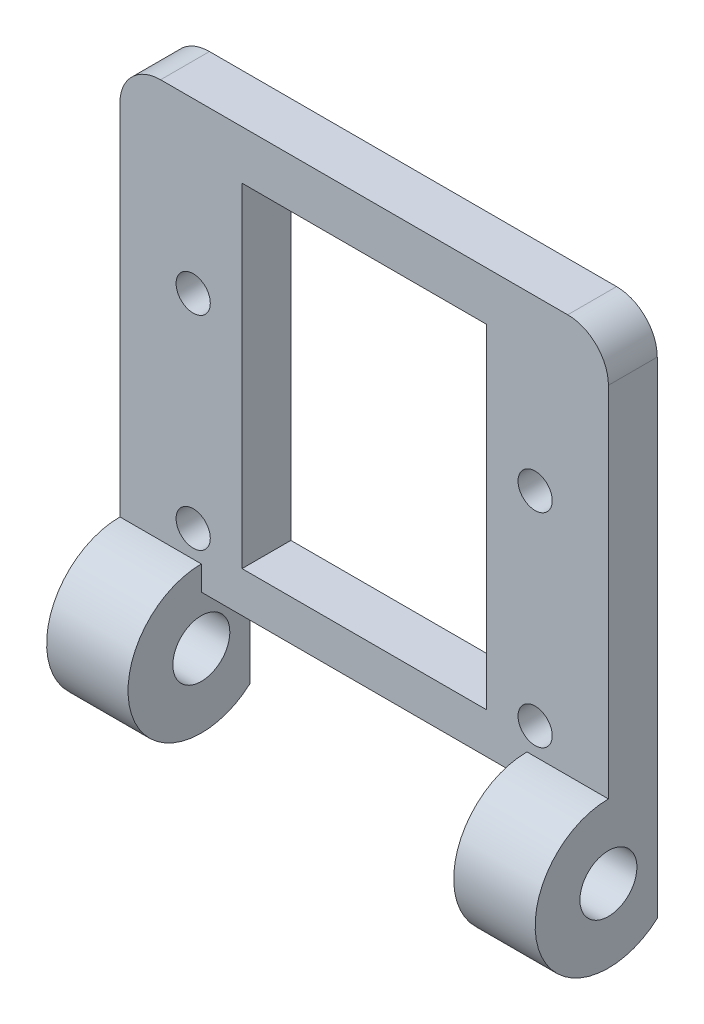
ISO-10303-21;
HEADER;
FILE_DESCRIPTION(('STEP AP214'),'2;1');
FILE_NAME('part.step','',(''),(''),'','','');
FILE_SCHEMA(('AUTOMOTIVE_DESIGN { 1 0 10303 214 1 1 1 1 }'));
ENDSEC;
DATA;
#1=APPLICATION_CONTEXT('core data for automotive mechanical design processes');
#2=APPLICATION_PROTOCOL_DEFINITION('international standard','automotive_design',2000,#1);
#3=PRODUCT_CONTEXT('',#1,'mechanical');
#4=PRODUCT('Part','Part','',(#3));
#5=PRODUCT_RELATED_PRODUCT_CATEGORY('part','',(#4));
#6=PRODUCT_DEFINITION_FORMATION('','',#4);
#7=PRODUCT_DEFINITION_CONTEXT('part definition',#1,'design');
#8=PRODUCT_DEFINITION('design','',#6,#7);
#9=PRODUCT_DEFINITION_SHAPE('','',#8);
#10=(LENGTH_UNIT() NAMED_UNIT(*) SI_UNIT(.MILLI.,.METRE.));
#11=(NAMED_UNIT(*) PLANE_ANGLE_UNIT() SI_UNIT($,.RADIAN.));
#12=(NAMED_UNIT(*) SI_UNIT($,.STERADIAN.) SOLID_ANGLE_UNIT());
#13=UNCERTAINTY_MEASURE_WITH_UNIT(LENGTH_MEASURE(1.E-05),#10,'distance_accuracy_value','');
#14=(GEOMETRIC_REPRESENTATION_CONTEXT(3) GLOBAL_UNCERTAINTY_ASSIGNED_CONTEXT((#13)) GLOBAL_UNIT_ASSIGNED_CONTEXT((#10,
#11,#12)) REPRESENTATION_CONTEXT('',''));
#15=CARTESIAN_POINT('',(0.,0.,0.));
#16=DIRECTION('',(0.,0.,1.));
#17=DIRECTION('',(1.,0.,0.));
#18=AXIS2_PLACEMENT_3D('',#15,#16,#17);
#19=CARTESIAN_POINT('',(0.,-13.,3.));
#20=DIRECTION('',(0.,-1.,0.));
#21=DIRECTION('',(1.,0.,0.));
#22=AXIS2_PLACEMENT_3D('',#19,#20,#21);
#23=PLANE('',#22);
#24=DIRECTION('',(-1.,0.,0.));
#25=VECTOR('',#24,1.);
#26=CARTESIAN_POINT('',(0.,-13.,3.));
#27=LINE('',#26,#25);
#28=CARTESIAN_POINT('',(10.,-13.,3.));
#29=VERTEX_POINT('',#28);
#30=CARTESIAN_POINT('',(-10.,-13.,3.));
#31=VERTEX_POINT('',#30);
#32=EDGE_CURVE('E155',#29,#31,#27,.T.);
#33=ORIENTED_EDGE('',*,*,#32,.T.);
#34=DIRECTION('',(0.,0.,-1.));
#35=VECTOR('',#34,1.);
#36=CARTESIAN_POINT('',(-10.,-13.,0.));
#37=LINE('',#36,#35);
#38=CARTESIAN_POINT('',(-10.,-13.,0.));
#39=VERTEX_POINT('',#38);
#40=EDGE_CURVE('E139',#31,#39,#37,.T.);
#41=ORIENTED_EDGE('',*,*,#40,.T.);
#42=DIRECTION('',(-1.,0.,0.));
#43=VECTOR('',#42,1.);
#44=CARTESIAN_POINT('',(0.,-13.,0.));
#45=LINE('',#44,#43);
#46=CARTESIAN_POINT('',(10.,-13.,0.));
#47=VERTEX_POINT('',#46);
#48=EDGE_CURVE('E200',#47,#39,#45,.T.);
#49=ORIENTED_EDGE('',*,*,#48,.F.);
#50=DIRECTION('',(0.,0.,-1.));
#51=VECTOR('',#50,1.);
#52=CARTESIAN_POINT('',(10.,-13.,0.));
#53=LINE('',#52,#51);
#54=EDGE_CURVE('E160',#29,#47,#53,.T.);
#55=ORIENTED_EDGE('',*,*,#54,.F.);
#56=EDGE_LOOP('',(#33,#41,#49,#55));
#57=FACE_BOUND('',#56,.T.);
#58=ADVANCED_FACE('F37',(#57),#23,.T.);
#59=CARTESIAN_POINT('',(0.,0.,3.));
#60=DIRECTION('',(0.,0.,1.));
#61=DIRECTION('',(1.,0.,0.));
#62=AXIS2_PLACEMENT_3D('',#59,#60,#61);
#63=PLANE('',#62);
#64=CARTESIAN_POINT('',(10.5,2.638,3.));
#65=DIRECTION('',(0.,0.,1.));
#66=DIRECTION('',(1.,0.,0.));
#67=AXIS2_PLACEMENT_3D('',#64,#65,#66);
#68=CIRCLE('',#67,1.05);
#69=CARTESIAN_POINT('',(11.55,2.638,3.));
#70=VERTEX_POINT('',#69);
#71=EDGE_CURVE('E210',#70,#70,#68,.F.);
#72=ORIENTED_EDGE('',*,*,#71,.T.);
#73=EDGE_LOOP('',(#72));
#74=FACE_BOUND('',#73,.T.);
#75=CARTESIAN_POINT('',(-10.5,2.638,3.));
#76=DIRECTION('',(0.,0.,1.));
#77=DIRECTION('',(1.,0.,0.));
#78=AXIS2_PLACEMENT_3D('',#75,#76,#77);
#79=CIRCLE('',#78,1.05);
#80=CARTESIAN_POINT('',(-9.45,2.638,3.));
#81=VERTEX_POINT('',#80);
#82=EDGE_CURVE('E278',#81,#81,#79,.T.);
#83=ORIENTED_EDGE('',*,*,#82,.F.);
#84=EDGE_LOOP('',(#83));
#85=FACE_BOUND('',#84,.T.);
#86=DIRECTION('',(0.,-1.,0.));
#87=VECTOR('',#86,1.);
#88=CARTESIAN_POINT('',(-7.5,0.,3.));
#89=LINE('',#88,#87);
#90=CARTESIAN_POINT('',(-7.5,9.99999999999999,3.));
#91=VERTEX_POINT('',#90);
#92=CARTESIAN_POINT('',(-7.49999999999999,-10.5,3.));
#93=VERTEX_POINT('',#92);
#94=EDGE_CURVE('E281',#91,#93,#89,.T.);
#95=ORIENTED_EDGE('',*,*,#94,.F.);
#96=DIRECTION('',(1.,0.,0.));
#97=VECTOR('',#96,1.);
#98=CARTESIAN_POINT('',(0.,9.99999999999999,3.));
#99=LINE('',#98,#97);
#100=CARTESIAN_POINT('',(7.5,9.99999999999999,3.));
#101=VERTEX_POINT('',#100);
#102=EDGE_CURVE('E284',#91,#101,#99,.T.);
#103=ORIENTED_EDGE('',*,*,#102,.T.);
#104=DIRECTION('',(0.,-1.,0.));
#105=VECTOR('',#104,1.);
#106=CARTESIAN_POINT('',(7.5,0.,3.));
#107=LINE('',#106,#105);
#108=CARTESIAN_POINT('',(7.50000000000001,-10.5,3.));
#109=VERTEX_POINT('',#108);
#110=EDGE_CURVE('E287',#101,#109,#107,.T.);
#111=ORIENTED_EDGE('',*,*,#110,.T.);
#112=DIRECTION('',(1.,0.,0.));
#113=VECTOR('',#112,1.);
#114=CARTESIAN_POINT('',(0.,-10.5,3.));
#115=LINE('',#114,#113);
#116=EDGE_CURVE('E289',#93,#109,#115,.T.);
#117=ORIENTED_EDGE('',*,*,#116,.F.);
#118=EDGE_LOOP('',(#95,#103,#111,#117));
#119=FACE_BOUND('',#118,.T.);
#120=CARTESIAN_POINT('',(-10.5,-9.862,3.));
#121=DIRECTION('',(0.,0.,1.));
#122=DIRECTION('',(1.,0.,0.));
#123=AXIS2_PLACEMENT_3D('',#120,#121,#122);
#124=CIRCLE('',#123,1.05);
#125=CARTESIAN_POINT('',(-9.44999999999999,-9.862,3.));
#126=VERTEX_POINT('',#125);
#127=EDGE_CURVE('E164',#126,#126,#124,.T.);
#128=ORIENTED_EDGE('',*,*,#127,.F.);
#129=EDGE_LOOP('',(#128));
#130=FACE_BOUND('',#129,.T.);
#131=CARTESIAN_POINT('',(10.5,-9.862,3.));
#132=DIRECTION('',(0.,0.,1.));
#133=DIRECTION('',(1.,0.,0.));
#134=AXIS2_PLACEMENT_3D('',#131,#132,#133);
#135=CIRCLE('',#134,1.05);
#136=CARTESIAN_POINT('',(11.55,-9.862,3.));
#137=VERTEX_POINT('',#136);
#138=EDGE_CURVE('E172',#137,#137,#135,.F.);
#139=ORIENTED_EDGE('',*,*,#138,.T.);
#140=EDGE_LOOP('',(#139));
#141=FACE_BOUND('',#140,.T.);
#142=DIRECTION('',(0.,-1.,0.));
#143=VECTOR('',#142,1.);
#144=CARTESIAN_POINT('',(-15.,0.,3.));
#145=LINE('',#144,#143);
#146=CARTESIAN_POINT('',(-15.,10.5,3.));
#147=VERTEX_POINT('',#146);
#148=CARTESIAN_POINT('',(-15.,-11.5,3.));
#149=VERTEX_POINT('',#148);
#150=EDGE_CURVE('E162',#147,#149,#145,.T.);
#151=ORIENTED_EDGE('',*,*,#150,.T.);
#152=DIRECTION('',(-1.,0.,0.));
#153=VECTOR('',#152,1.);
#154=CARTESIAN_POINT('',(-10.,-11.5,3.));
#155=LINE('',#154,#153);
#156=CARTESIAN_POINT('',(-10.,-11.5,3.));
#157=VERTEX_POINT('',#156);
#158=EDGE_CURVE('E156',#157,#149,#155,.T.);
#159=ORIENTED_EDGE('',*,*,#158,.F.);
#160=DIRECTION('',(0.,-1.,0.));
#161=VECTOR('',#160,1.);
#162=CARTESIAN_POINT('',(-9.99999999999999,0.,3.));
#163=LINE('',#162,#161);
#164=EDGE_CURVE('E143',#157,#31,#163,.T.);
#165=ORIENTED_EDGE('',*,*,#164,.T.);
#166=ORIENTED_EDGE('',*,*,#32,.F.);
#167=DIRECTION('',(0.,-1.,0.));
#168=VECTOR('',#167,1.);
#169=CARTESIAN_POINT('',(9.99999999999999,0.,3.));
#170=LINE('',#169,#168);
#171=CARTESIAN_POINT('',(10.,-11.5,3.));
#172=VERTEX_POINT('',#171);
#173=EDGE_CURVE('E267',#172,#29,#170,.T.);
#174=ORIENTED_EDGE('',*,*,#173,.F.);
#175=DIRECTION('',(1.,0.,0.));
#176=VECTOR('',#175,1.);
#177=CARTESIAN_POINT('',(10.,-11.5,3.));
#178=LINE('',#177,#176);
#179=CARTESIAN_POINT('',(15.,-11.5,3.));
#180=VERTEX_POINT('',#179);
#181=EDGE_CURVE('E274',#172,#180,#178,.T.);
#182=ORIENTED_EDGE('',*,*,#181,.T.);
#183=DIRECTION('',(0.,-1.,0.));
#184=VECTOR('',#183,1.);
#185=CARTESIAN_POINT('',(15.,0.,3.));
#186=LINE('',#185,#184);
#187=CARTESIAN_POINT('',(15.,10.5,3.));
#188=VERTEX_POINT('',#187);
#189=EDGE_CURVE('E161',#188,#180,#186,.T.);
#190=ORIENTED_EDGE('',*,*,#189,.F.);
#191=CARTESIAN_POINT('',(12.5,10.5,3.));
#192=DIRECTION('',(0.,0.,1.));
#193=DIRECTION('',(1.,0.,0.));
#194=AXIS2_PLACEMENT_3D('',#191,#192,#193);
#195=CIRCLE('',#194,2.5);
#196=CARTESIAN_POINT('',(12.5,13.,3.));
#197=VERTEX_POINT('',#196);
#198=EDGE_CURVE('E231',#188,#197,#195,.T.);
#199=ORIENTED_EDGE('',*,*,#198,.T.);
#200=DIRECTION('',(-1.,0.,0.));
#201=VECTOR('',#200,1.);
#202=CARTESIAN_POINT('',(0.,13.,3.));
#203=LINE('',#202,#201);
#204=CARTESIAN_POINT('',(-12.5,13.,3.));
#205=VERTEX_POINT('',#204);
#206=EDGE_CURVE('E166',#197,#205,#203,.T.);
#207=ORIENTED_EDGE('',*,*,#206,.T.);
#208=CARTESIAN_POINT('',(-12.5,10.5,3.));
#209=DIRECTION('',(0.,0.,1.));
#210=DIRECTION('',(1.,0.,0.));
#211=AXIS2_PLACEMENT_3D('',#208,#209,#210);
#212=CIRCLE('',#211,2.5);
#213=EDGE_CURVE('E45',#205,#147,#212,.T.);
#214=ORIENTED_EDGE('',*,*,#213,.T.);
#215=EDGE_LOOP('',(#151,#159,#165,#166,#174,#182,#190,#199,#207,#214));
#216=FACE_BOUND('',#215,.T.);
#217=ADVANCED_FACE('F153',(#74,#85,#119,#130,#141,#216),#63,.T.);
#218=CARTESIAN_POINT('',(0.,13.,3.));
#219=DIRECTION('',(0.,-1.,0.));
#220=DIRECTION('',(1.,0.,0.));
#221=AXIS2_PLACEMENT_3D('',#218,#219,#220);
#222=PLANE('',#221);
#223=DIRECTION('',(-1.,0.,0.));
#224=VECTOR('',#223,1.);
#225=CARTESIAN_POINT('',(0.,13.,0.));
#226=LINE('',#225,#224);
#227=CARTESIAN_POINT('',(12.5,13.,0.));
#228=VERTEX_POINT('',#227);
#229=CARTESIAN_POINT('',(-12.5,13.,0.));
#230=VERTEX_POINT('',#229);
#231=EDGE_CURVE('E195',#228,#230,#226,.T.);
#232=ORIENTED_EDGE('',*,*,#231,.T.);
#233=DIRECTION('',(0.,0.,-1.));
#234=VECTOR('',#233,1.);
#235=CARTESIAN_POINT('',(-12.5,13.,3.));
#236=LINE('',#235,#234);
#237=EDGE_CURVE('E229',#230,#205,#236,.F.);
#238=ORIENTED_EDGE('',*,*,#237,.T.);
#239=ORIENTED_EDGE('',*,*,#206,.F.);
#240=DIRECTION('',(0.,0.,-1.));
#241=VECTOR('',#240,1.);
#242=CARTESIAN_POINT('',(12.5,13.,0.));
#243=LINE('',#242,#241);
#244=EDGE_CURVE('E226',#197,#228,#243,.T.);
#245=ORIENTED_EDGE('',*,*,#244,.T.);
#246=EDGE_LOOP('',(#232,#238,#239,#245));
#247=FACE_BOUND('',#246,.T.);
#248=ADVANCED_FACE('F252',(#247),#222,.F.);
#249=CARTESIAN_POINT('',(-15.,0.,3.));
#250=DIRECTION('',(1.,0.,0.));
#251=DIRECTION('',(0.,1.,0.));
#252=AXIS2_PLACEMENT_3D('',#249,#250,#251);
#253=PLANE('',#252);
#254=DIRECTION('',(0.,-1.,0.));
#255=VECTOR('',#254,1.);
#256=CARTESIAN_POINT('',(-15.,0.,0.));
#257=LINE('',#256,#255);
#258=CARTESIAN_POINT('',(-15.,10.5,0.));
#259=VERTEX_POINT('',#258);
#260=CARTESIAN_POINT('',(-15.,-19.3541019662497,0.));
#261=VERTEX_POINT('',#260);
#262=EDGE_CURVE('E198',#259,#261,#257,.T.);
#263=ORIENTED_EDGE('',*,*,#262,.T.);
#264=CARTESIAN_POINT('',(-15.,-16.,3.));
#265=DIRECTION('',(1.,0.,0.));
#266=DIRECTION('',(0.,1.,0.));
#267=AXIS2_PLACEMENT_3D('',#264,#265,#266);
#268=CIRCLE('',#267,4.5);
#269=EDGE_CURVE('E245',#149,#261,#268,.T.);
#270=ORIENTED_EDGE('',*,*,#269,.F.);
#271=ORIENTED_EDGE('',*,*,#150,.F.);
#272=DIRECTION('',(0.,0.,-1.));
#273=VECTOR('',#272,1.);
#274=CARTESIAN_POINT('',(-15.,10.5,3.));
#275=LINE('',#274,#273);
#276=EDGE_CURVE('E219',#147,#259,#275,.T.);
#277=ORIENTED_EDGE('',*,*,#276,.T.);
#278=EDGE_LOOP('',(#263,#270,#271,#277));
#279=FACE_BOUND('',#278,.T.);
#280=CARTESIAN_POINT('',(-15.,-16.,3.));
#281=DIRECTION('',(1.,0.,0.));
#282=DIRECTION('',(0.,1.,0.));
#283=AXIS2_PLACEMENT_3D('',#280,#281,#282);
#284=CIRCLE('',#283,1.75);
#285=CARTESIAN_POINT('',(-15.,-14.25,3.));
#286=VERTEX_POINT('',#285);
#287=EDGE_CURVE('E383',#286,#286,#284,.T.);
#288=ORIENTED_EDGE('',*,*,#287,.T.);
#289=EDGE_LOOP('',(#288));
#290=FACE_BOUND('',#289,.T.);
#291=ADVANCED_FACE('F241',(#279,#290),#253,.F.);
#292=CARTESIAN_POINT('',(-7.5,0.,3.));
#293=DIRECTION('',(1.,0.,0.));
#294=DIRECTION('',(0.,1.,0.));
#295=AXIS2_PLACEMENT_3D('',#292,#293,#294);
#296=PLANE('',#295);
#297=DIRECTION('',(0.,-1.,0.));
#298=VECTOR('',#297,1.);
#299=CARTESIAN_POINT('',(-7.5,0.,0.));
#300=LINE('',#299,#298);
#301=CARTESIAN_POINT('',(-7.5,9.99999999999999,0.));
#302=VERTEX_POINT('',#301);
#303=CARTESIAN_POINT('',(-7.49999999999999,-10.5,0.));
#304=VERTEX_POINT('',#303);
#305=EDGE_CURVE('E183',#302,#304,#300,.T.);
#306=ORIENTED_EDGE('',*,*,#305,.F.);
#307=DIRECTION('',(0.,0.,-1.));
#308=VECTOR('',#307,1.);
#309=CARTESIAN_POINT('',(-7.5,9.99999999999999,3.));
#310=LINE('',#309,#308);
#311=EDGE_CURVE('E217',#91,#302,#310,.T.);
#312=ORIENTED_EDGE('',*,*,#311,.F.);
#313=ORIENTED_EDGE('',*,*,#94,.T.);
#314=DIRECTION('',(0.,0.,-1.));
#315=VECTOR('',#314,1.);
#316=CARTESIAN_POINT('',(-7.49999999999999,-10.5,3.));
#317=LINE('',#316,#315);
#318=EDGE_CURVE('E175',#93,#304,#317,.T.);
#319=ORIENTED_EDGE('',*,*,#318,.T.);
#320=EDGE_LOOP('',(#306,#312,#313,#319));
#321=FACE_BOUND('',#320,.T.);
#322=ADVANCED_FACE('F307',(#321),#296,.T.);
#323=CARTESIAN_POINT('',(0.,9.99999999999999,3.));
#324=DIRECTION('',(0.,1.,0.));
#325=DIRECTION('',(-1.,0.,0.));
#326=AXIS2_PLACEMENT_3D('',#323,#324,#325);
#327=PLANE('',#326);
#328=DIRECTION('',(1.,0.,0.));
#329=VECTOR('',#328,1.);
#330=CARTESIAN_POINT('',(0.,9.99999999999999,0.));
#331=LINE('',#330,#329);
#332=CARTESIAN_POINT('',(7.5,9.99999999999999,0.));
#333=VERTEX_POINT('',#332);
#334=EDGE_CURVE('E186',#302,#333,#331,.T.);
#335=ORIENTED_EDGE('',*,*,#334,.T.);
#336=DIRECTION('',(0.,0.,-1.));
#337=VECTOR('',#336,1.);
#338=CARTESIAN_POINT('',(7.5,9.99999999999999,3.));
#339=LINE('',#338,#337);
#340=EDGE_CURVE('E214',#101,#333,#339,.T.);
#341=ORIENTED_EDGE('',*,*,#340,.F.);
#342=ORIENTED_EDGE('',*,*,#102,.F.);
#343=ORIENTED_EDGE('',*,*,#311,.T.);
#344=EDGE_LOOP('',(#335,#341,#342,#343));
#345=FACE_BOUND('',#344,.T.);
#346=ADVANCED_FACE('F309',(#345),#327,.F.);
#347=CARTESIAN_POINT('',(7.5,0.,3.));
#348=DIRECTION('',(1.,0.,0.));
#349=DIRECTION('',(0.,1.,0.));
#350=AXIS2_PLACEMENT_3D('',#347,#348,#349);
#351=PLANE('',#350);
#352=DIRECTION('',(0.,-1.,0.));
#353=VECTOR('',#352,1.);
#354=CARTESIAN_POINT('',(7.5,0.,0.));
#355=LINE('',#354,#353);
#356=CARTESIAN_POINT('',(7.50000000000001,-10.5,0.));
#357=VERTEX_POINT('',#356);
#358=EDGE_CURVE('E189',#333,#357,#355,.T.);
#359=ORIENTED_EDGE('',*,*,#358,.T.);
#360=DIRECTION('',(0.,0.,-1.));
#361=VECTOR('',#360,1.);
#362=CARTESIAN_POINT('',(7.50000000000001,-10.5,3.));
#363=LINE('',#362,#361);
#364=EDGE_CURVE('E212',#109,#357,#363,.T.);
#365=ORIENTED_EDGE('',*,*,#364,.F.);
#366=ORIENTED_EDGE('',*,*,#110,.F.);
#367=ORIENTED_EDGE('',*,*,#340,.T.);
#368=EDGE_LOOP('',(#359,#365,#366,#367));
#369=FACE_BOUND('',#368,.T.);
#370=ADVANCED_FACE('F302',(#369),#351,.F.);
#371=CARTESIAN_POINT('',(-10.5,-9.862,3.));
#372=DIRECTION('',(0.,0.,-1.));
#373=DIRECTION('',(-1.,0.,0.));
#374=AXIS2_PLACEMENT_3D('',#371,#372,#373);
#375=CYLINDRICAL_SURFACE('',#374,1.05);
#376=ORIENTED_EDGE('',*,*,#127,.T.);
#377=EDGE_LOOP('',(#376));
#378=FACE_BOUND('',#377,.T.);
#379=CARTESIAN_POINT('',(-10.5,-9.862,0.));
#380=DIRECTION('',(0.,0.,1.));
#381=DIRECTION('',(1.,0.,0.));
#382=AXIS2_PLACEMENT_3D('',#379,#380,#381);
#383=CIRCLE('',#382,1.05);
#384=CARTESIAN_POINT('',(-9.44999999999999,-9.862,0.));
#385=VERTEX_POINT('',#384);
#386=EDGE_CURVE('E204',#385,#385,#383,.T.);
#387=ORIENTED_EDGE('',*,*,#386,.F.);
#388=EDGE_LOOP('',(#387));
#389=FACE_BOUND('',#388,.T.);
#390=ADVANCED_FACE('F316',(#378,#389),#375,.F.);
#391=CARTESIAN_POINT('',(15.,0.,3.));
#392=DIRECTION('',(1.,0.,0.));
#393=DIRECTION('',(0.,1.,0.));
#394=AXIS2_PLACEMENT_3D('',#391,#392,#393);
#395=PLANE('',#394);
#396=CARTESIAN_POINT('',(15.,-16.,3.));
#397=DIRECTION('',(1.,0.,0.));
#398=DIRECTION('',(0.,1.,0.));
#399=AXIS2_PLACEMENT_3D('',#396,#397,#398);
#400=CIRCLE('',#399,4.5);
#401=CARTESIAN_POINT('',(15.,-19.3541019662497,0.));
#402=VERTEX_POINT('',#401);
#403=EDGE_CURVE('E260',#180,#402,#400,.T.);
#404=ORIENTED_EDGE('',*,*,#403,.T.);
#405=DIRECTION('',(0.,-1.,0.));
#406=VECTOR('',#405,1.);
#407=CARTESIAN_POINT('',(15.,0.,0.));
#408=LINE('',#407,#406);
#409=CARTESIAN_POINT('',(15.,10.5,0.));
#410=VERTEX_POINT('',#409);
#411=EDGE_CURVE('E202',#410,#402,#408,.T.);
#412=ORIENTED_EDGE('',*,*,#411,.F.);
#413=DIRECTION('',(0.,0.,-1.));
#414=VECTOR('',#413,1.);
#415=CARTESIAN_POINT('',(15.,10.5,3.));
#416=LINE('',#415,#414);
#417=EDGE_CURVE('E11',#410,#188,#416,.F.);
#418=ORIENTED_EDGE('',*,*,#417,.T.);
#419=ORIENTED_EDGE('',*,*,#189,.T.);
#420=EDGE_LOOP('',(#404,#412,#418,#419));
#421=FACE_BOUND('',#420,.T.);
#422=CARTESIAN_POINT('',(15.,-16.,3.));
#423=DIRECTION('',(1.,0.,0.));
#424=DIRECTION('',(0.,1.,0.));
#425=AXIS2_PLACEMENT_3D('',#422,#423,#424);
#426=CIRCLE('',#425,1.75);
#427=CARTESIAN_POINT('',(15.,-14.25,3.));
#428=VERTEX_POINT('',#427);
#429=EDGE_CURVE('E264',#428,#428,#426,.T.);
#430=ORIENTED_EDGE('',*,*,#429,.F.);
#431=EDGE_LOOP('',(#430));
#432=FACE_BOUND('',#431,.T.);
#433=ADVANCED_FACE('F258',(#421,#432),#395,.T.);
#434=CARTESIAN_POINT('',(0.,-10.5,3.));
#435=DIRECTION('',(0.,1.,0.));
#436=DIRECTION('',(-1.,0.,0.));
#437=AXIS2_PLACEMENT_3D('',#434,#435,#436);
#438=PLANE('',#437);
#439=DIRECTION('',(1.,0.,0.));
#440=VECTOR('',#439,1.);
#441=CARTESIAN_POINT('',(0.,-10.5,0.));
#442=LINE('',#441,#440);
#443=EDGE_CURVE('E192',#304,#357,#442,.T.);
#444=ORIENTED_EDGE('',*,*,#443,.F.);
#445=ORIENTED_EDGE('',*,*,#318,.F.);
#446=ORIENTED_EDGE('',*,*,#116,.T.);
#447=ORIENTED_EDGE('',*,*,#364,.T.);
#448=EDGE_LOOP('',(#444,#445,#446,#447));
#449=FACE_BOUND('',#448,.T.);
#450=ADVANCED_FACE('F294',(#449),#438,.T.);
#451=CARTESIAN_POINT('',(-10.5,2.638,3.));
#452=DIRECTION('',(0.,0.,-1.));
#453=DIRECTION('',(-1.,0.,0.));
#454=AXIS2_PLACEMENT_3D('',#451,#452,#453);
#455=CYLINDRICAL_SURFACE('',#454,1.05);
#456=ORIENTED_EDGE('',*,*,#82,.T.);
#457=EDGE_LOOP('',(#456));
#458=FACE_BOUND('',#457,.T.);
#459=CARTESIAN_POINT('',(-10.5,2.638,0.));
#460=DIRECTION('',(0.,0.,1.));
#461=DIRECTION('',(1.,0.,0.));
#462=AXIS2_PLACEMENT_3D('',#459,#460,#461);
#463=CIRCLE('',#462,1.05);
#464=CARTESIAN_POINT('',(-9.45,2.638,0.));
#465=VERTEX_POINT('',#464);
#466=EDGE_CURVE('E179',#465,#465,#463,.T.);
#467=ORIENTED_EDGE('',*,*,#466,.F.);
#468=EDGE_LOOP('',(#467));
#469=FACE_BOUND('',#468,.T.);
#470=ADVANCED_FACE('F334',(#458,#469),#455,.F.);
#471=CARTESIAN_POINT('',(10.5,2.638,3.));
#472=DIRECTION('',(0.,0.,-1.));
#473=DIRECTION('',(-1.,0.,0.));
#474=AXIS2_PLACEMENT_3D('',#471,#472,#473);
#475=CYLINDRICAL_SURFACE('',#474,1.05);
#476=ORIENTED_EDGE('',*,*,#71,.F.);
#477=EDGE_LOOP('',(#476));
#478=FACE_BOUND('',#477,.T.);
#479=CARTESIAN_POINT('',(10.5,2.638,0.));
#480=DIRECTION('',(0.,0.,1.));
#481=DIRECTION('',(1.,0.,0.));
#482=AXIS2_PLACEMENT_3D('',#479,#480,#481);
#483=CIRCLE('',#482,1.05);
#484=CARTESIAN_POINT('',(11.55,2.638,0.));
#485=VERTEX_POINT('',#484);
#486=EDGE_CURVE('E176',#485,#485,#483,.F.);
#487=ORIENTED_EDGE('',*,*,#486,.T.);
#488=EDGE_LOOP('',(#487));
#489=FACE_BOUND('',#488,.T.);
#490=ADVANCED_FACE('F339',(#478,#489),#475,.F.);
#491=CARTESIAN_POINT('',(10.5,-9.862,3.));
#492=DIRECTION('',(0.,0.,-1.));
#493=DIRECTION('',(-1.,0.,0.));
#494=AXIS2_PLACEMENT_3D('',#491,#492,#493);
#495=CYLINDRICAL_SURFACE('',#494,1.05);
#496=ORIENTED_EDGE('',*,*,#138,.F.);
#497=EDGE_LOOP('',(#496));
#498=FACE_BOUND('',#497,.T.);
#499=CARTESIAN_POINT('',(10.5,-9.862,0.));
#500=DIRECTION('',(0.,0.,1.));
#501=DIRECTION('',(1.,0.,0.));
#502=AXIS2_PLACEMENT_3D('',#499,#500,#501);
#503=CIRCLE('',#502,1.05);
#504=CARTESIAN_POINT('',(11.55,-9.862,0.));
#505=VERTEX_POINT('',#504);
#506=EDGE_CURVE('E207',#505,#505,#503,.F.);
#507=ORIENTED_EDGE('',*,*,#506,.T.);
#508=EDGE_LOOP('',(#507));
#509=FACE_BOUND('',#508,.T.);
#510=ADVANCED_FACE('F350',(#498,#509),#495,.F.);
#511=CARTESIAN_POINT('',(0.,0.,0.));
#512=DIRECTION('',(0.,0.,1.));
#513=DIRECTION('',(1.,0.,0.));
#514=AXIS2_PLACEMENT_3D('',#511,#512,#513);
#515=PLANE('',#514);
#516=ORIENTED_EDGE('',*,*,#486,.F.);
#517=EDGE_LOOP('',(#516));
#518=FACE_BOUND('',#517,.T.);
#519=ORIENTED_EDGE('',*,*,#466,.T.);
#520=EDGE_LOOP('',(#519));
#521=FACE_BOUND('',#520,.T.);
#522=ORIENTED_EDGE('',*,*,#305,.T.);
#523=ORIENTED_EDGE('',*,*,#443,.T.);
#524=ORIENTED_EDGE('',*,*,#358,.F.);
#525=ORIENTED_EDGE('',*,*,#334,.F.);
#526=EDGE_LOOP('',(#522,#523,#524,#525));
#527=FACE_BOUND('',#526,.T.);
#528=ORIENTED_EDGE('',*,*,#262,.F.);
#529=CARTESIAN_POINT('',(-12.5,10.5,0.));
#530=DIRECTION('',(0.,0.,1.));
#531=DIRECTION('',(1.,0.,0.));
#532=AXIS2_PLACEMENT_3D('',#529,#530,#531);
#533=CIRCLE('',#532,2.5);
#534=EDGE_CURVE('E224',#259,#230,#533,.F.);
#535=ORIENTED_EDGE('',*,*,#534,.T.);
#536=ORIENTED_EDGE('',*,*,#231,.F.);
#537=CARTESIAN_POINT('',(12.5,10.5,0.));
#538=DIRECTION('',(0.,0.,1.));
#539=DIRECTION('',(1.,0.,0.));
#540=AXIS2_PLACEMENT_3D('',#537,#538,#539);
#541=CIRCLE('',#540,2.5);
#542=EDGE_CURVE('E222',#228,#410,#541,.F.);
#543=ORIENTED_EDGE('',*,*,#542,.T.);
#544=ORIENTED_EDGE('',*,*,#411,.T.);
#545=DIRECTION('',(1.,0.,0.));
#546=VECTOR('',#545,1.);
#547=CARTESIAN_POINT('',(10.,-19.3541019662497,0.));
#548=LINE('',#547,#546);
#549=CARTESIAN_POINT('',(10.,-19.3541019662497,0.));
#550=VERTEX_POINT('',#549);
#551=EDGE_CURVE('E180',#550,#402,#548,.T.);
#552=ORIENTED_EDGE('',*,*,#551,.F.);
#553=DIRECTION('',(0.,1.,0.));
#554=VECTOR('',#553,1.);
#555=CARTESIAN_POINT('',(9.99999999999999,0.,0.));
#556=LINE('',#555,#554);
#557=EDGE_CURVE('E52',#550,#47,#556,.T.);
#558=ORIENTED_EDGE('',*,*,#557,.T.);
#559=ORIENTED_EDGE('',*,*,#48,.T.);
#560=DIRECTION('',(0.,1.,0.));
#561=VECTOR('',#560,1.);
#562=CARTESIAN_POINT('',(-9.99999999999999,0.,0.));
#563=LINE('',#562,#561);
#564=CARTESIAN_POINT('',(-10.,-19.3541019662497,0.));
#565=VERTEX_POINT('',#564);
#566=EDGE_CURVE('E145',#565,#39,#563,.T.);
#567=ORIENTED_EDGE('',*,*,#566,.F.);
#568=DIRECTION('',(-1.,0.,0.));
#569=VECTOR('',#568,1.);
#570=CARTESIAN_POINT('',(-10.,-19.3541019662497,0.));
#571=LINE('',#570,#569);
#572=EDGE_CURVE('E389',#565,#261,#571,.T.);
#573=ORIENTED_EDGE('',*,*,#572,.T.);
#574=EDGE_LOOP('',(#528,#535,#536,#543,#544,#552,#558,#559,#567,#573));
#575=FACE_BOUND('',#574,.T.);
#576=ORIENTED_EDGE('',*,*,#386,.T.);
#577=EDGE_LOOP('',(#576));
#578=FACE_BOUND('',#577,.T.);
#579=ORIENTED_EDGE('',*,*,#506,.F.);
#580=EDGE_LOOP('',(#579));
#581=FACE_BOUND('',#580,.T.);
#582=ADVANCED_FACE('F248',(#518,#521,#527,#575,#578,#581),#515,.F.);
#583=CARTESIAN_POINT('',(-12.5,10.5,3.));
#584=DIRECTION('',(0.,0.,-1.));
#585=DIRECTION('',(-1.,0.,0.));
#586=AXIS2_PLACEMENT_3D('',#583,#584,#585);
#587=CYLINDRICAL_SURFACE('',#586,2.5);
#588=ORIENTED_EDGE('',*,*,#213,.F.);
#589=ORIENTED_EDGE('',*,*,#237,.F.);
#590=ORIENTED_EDGE('',*,*,#534,.F.);
#591=ORIENTED_EDGE('',*,*,#276,.F.);
#592=EDGE_LOOP('',(#588,#589,#590,#591));
#593=FACE_BOUND('',#592,.T.);
#594=ADVANCED_FACE('F246',(#593),#587,.T.);
#595=CARTESIAN_POINT('',(12.5,10.5,3.));
#596=DIRECTION('',(0.,0.,1.));
#597=DIRECTION('',(1.,0.,0.));
#598=AXIS2_PLACEMENT_3D('',#595,#596,#597);
#599=CYLINDRICAL_SURFACE('',#598,2.5);
#600=ORIENTED_EDGE('',*,*,#198,.F.);
#601=ORIENTED_EDGE('',*,*,#417,.F.);
#602=ORIENTED_EDGE('',*,*,#542,.F.);
#603=ORIENTED_EDGE('',*,*,#244,.F.);
#604=EDGE_LOOP('',(#600,#601,#602,#603));
#605=FACE_BOUND('',#604,.T.);
#606=ADVANCED_FACE('F39',(#605),#599,.T.);
#607=CARTESIAN_POINT('',(10.,-16.,3.));
#608=DIRECTION('',(1.,0.,0.));
#609=DIRECTION('',(0.,1.,0.));
#610=AXIS2_PLACEMENT_3D('',#607,#608,#609);
#611=CYLINDRICAL_SURFACE('',#610,1.75);
#612=CARTESIAN_POINT('',(10.,-16.,3.));
#613=DIRECTION('',(1.,0.,0.));
#614=DIRECTION('',(0.,1.,0.));
#615=AXIS2_PLACEMENT_3D('',#612,#613,#614);
#616=CIRCLE('',#615,1.75);
#617=CARTESIAN_POINT('',(10.,-14.25,3.));
#618=VERTEX_POINT('',#617);
#619=EDGE_CURVE('E263',#618,#618,#616,.T.);
#620=ORIENTED_EDGE('',*,*,#619,.F.);
#621=EDGE_LOOP('',(#620));
#622=FACE_BOUND('',#621,.T.);
#623=ORIENTED_EDGE('',*,*,#429,.T.);
#624=EDGE_LOOP('',(#623));
#625=FACE_BOUND('',#624,.T.);
#626=ADVANCED_FACE('F357',(#622,#625),#611,.F.);
#627=CARTESIAN_POINT('',(10.,-16.,3.));
#628=DIRECTION('',(1.,0.,0.));
#629=DIRECTION('',(0.,1.,0.));
#630=AXIS2_PLACEMENT_3D('',#627,#628,#629);
#631=CYLINDRICAL_SURFACE('',#630,4.5);
#632=ORIENTED_EDGE('',*,*,#403,.F.);
#633=ORIENTED_EDGE('',*,*,#181,.F.);
#634=CARTESIAN_POINT('',(10.,-16.,3.));
#635=DIRECTION('',(1.,0.,0.));
#636=DIRECTION('',(0.,1.,0.));
#637=AXIS2_PLACEMENT_3D('',#634,#635,#636);
#638=CIRCLE('',#637,4.5);
#639=EDGE_CURVE('E395',#172,#550,#638,.T.);
#640=ORIENTED_EDGE('',*,*,#639,.T.);
#641=ORIENTED_EDGE('',*,*,#551,.T.);
#642=EDGE_LOOP('',(#632,#633,#640,#641));
#643=FACE_BOUND('',#642,.T.);
#644=ADVANCED_FACE('F360',(#643),#631,.T.);
#645=CARTESIAN_POINT('',(9.99999999999999,0.,0.));
#646=DIRECTION('',(1.,0.,0.));
#647=DIRECTION('',(0.,1.,0.));
#648=AXIS2_PLACEMENT_3D('',#645,#646,#647);
#649=PLANE('',#648);
#650=ORIENTED_EDGE('',*,*,#619,.T.);
#651=EDGE_LOOP('',(#650));
#652=FACE_BOUND('',#651,.T.);
#653=ORIENTED_EDGE('',*,*,#173,.T.);
#654=ORIENTED_EDGE('',*,*,#54,.T.);
#655=ORIENTED_EDGE('',*,*,#557,.F.);
#656=ORIENTED_EDGE('',*,*,#639,.F.);
#657=EDGE_LOOP('',(#653,#654,#655,#656));
#658=FACE_BOUND('',#657,.T.);
#659=ADVANCED_FACE('F364',(#652,#658),#649,.F.);
#660=CARTESIAN_POINT('',(-10.,-16.,3.));
#661=DIRECTION('',(-1.,0.,0.));
#662=DIRECTION('',(0.,-1.,0.));
#663=AXIS2_PLACEMENT_3D('',#660,#661,#662);
#664=CYLINDRICAL_SURFACE('',#663,4.5);
#665=ORIENTED_EDGE('',*,*,#269,.T.);
#666=ORIENTED_EDGE('',*,*,#572,.F.);
#667=CARTESIAN_POINT('',(-10.,-16.,3.));
#668=DIRECTION('',(1.,0.,0.));
#669=DIRECTION('',(0.,1.,0.));
#670=AXIS2_PLACEMENT_3D('',#667,#668,#669);
#671=CIRCLE('',#670,4.5);
#672=EDGE_CURVE('E387',#157,#565,#671,.T.);
#673=ORIENTED_EDGE('',*,*,#672,.F.);
#674=ORIENTED_EDGE('',*,*,#158,.T.);
#675=EDGE_LOOP('',(#665,#666,#673,#674));
#676=FACE_BOUND('',#675,.T.);
#677=ADVANCED_FACE('F367',(#676),#664,.T.);
#678=CARTESIAN_POINT('',(-10.,-16.,3.));
#679=DIRECTION('',(-1.,0.,0.));
#680=DIRECTION('',(0.,-1.,0.));
#681=AXIS2_PLACEMENT_3D('',#678,#679,#680);
#682=CYLINDRICAL_SURFACE('',#681,1.75);
#683=CARTESIAN_POINT('',(-10.,-16.,3.));
#684=DIRECTION('',(1.,0.,0.));
#685=DIRECTION('',(0.,1.,0.));
#686=AXIS2_PLACEMENT_3D('',#683,#684,#685);
#687=CIRCLE('',#686,1.75);
#688=CARTESIAN_POINT('',(-10.,-14.25,3.));
#689=VERTEX_POINT('',#688);
#690=EDGE_CURVE('E157',#689,#689,#687,.T.);
#691=ORIENTED_EDGE('',*,*,#690,.T.);
#692=EDGE_LOOP('',(#691));
#693=FACE_BOUND('',#692,.T.);
#694=ORIENTED_EDGE('',*,*,#287,.F.);
#695=EDGE_LOOP('',(#694));
#696=FACE_BOUND('',#695,.T.);
#697=ADVANCED_FACE('F369',(#693,#696),#682,.F.);
#698=CARTESIAN_POINT('',(-9.99999999999999,0.,0.));
#699=DIRECTION('',(-1.,0.,0.));
#700=DIRECTION('',(0.,1.,0.));
#701=AXIS2_PLACEMENT_3D('',#698,#699,#700);
#702=PLANE('',#701);
#703=ORIENTED_EDGE('',*,*,#690,.F.);
#704=EDGE_LOOP('',(#703));
#705=FACE_BOUND('',#704,.T.);
#706=ORIENTED_EDGE('',*,*,#164,.F.);
#707=ORIENTED_EDGE('',*,*,#672,.T.);
#708=ORIENTED_EDGE('',*,*,#566,.T.);
#709=ORIENTED_EDGE('',*,*,#40,.F.);
#710=EDGE_LOOP('',(#706,#707,#708,#709));
#711=FACE_BOUND('',#710,.T.);
#712=ADVANCED_FACE('F141',(#705,#711),#702,.F.);
#713=CLOSED_SHELL('',(#58,#217,#248,#291,#322,#346,#370,#390,#433,#450,#470,#490,#510,#582,#594,
#606,#626,#644,#659,#677,#697,#712));
#714=MANIFOLD_SOLID_BREP('B2',#713);
#715=ADVANCED_BREP_SHAPE_REPRESENTATION('',(#18,#714),#14);
#716=SHAPE_DEFINITION_REPRESENTATION(#9,#715);
ENDSEC;
END-ISO-10303-21;
